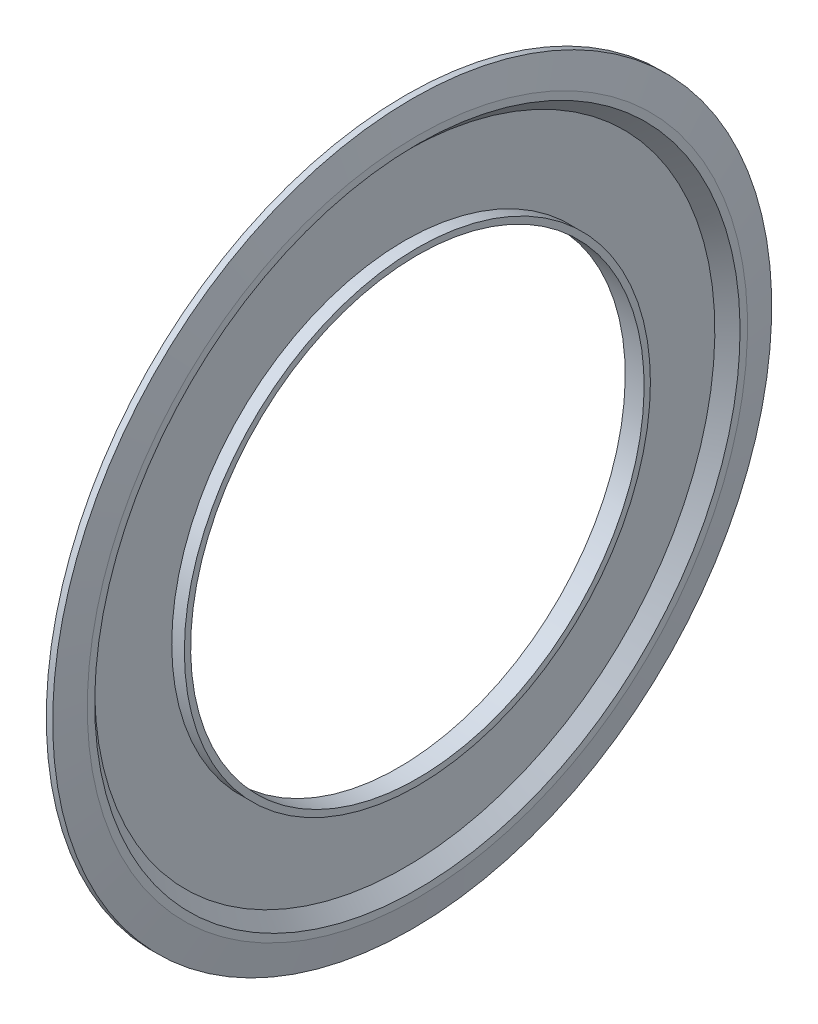
ISO-10303-21;
HEADER;
FILE_DESCRIPTION(('STEP AP214'),'2;1');
FILE_NAME('part.step','',(''),(''),'','','');
FILE_SCHEMA(('AUTOMOTIVE_DESIGN { 1 0 10303 214 1 1 1 1 }'));
ENDSEC;
DATA;
#1=APPLICATION_CONTEXT('core data for automotive mechanical design processes');
#2=APPLICATION_PROTOCOL_DEFINITION('international standard','automotive_design',2000,#1);
#3=PRODUCT_CONTEXT('',#1,'mechanical');
#4=PRODUCT('Part','Part','',(#3));
#5=PRODUCT_RELATED_PRODUCT_CATEGORY('part','',(#4));
#6=PRODUCT_DEFINITION_FORMATION('','',#4);
#7=PRODUCT_DEFINITION_CONTEXT('part definition',#1,'design');
#8=PRODUCT_DEFINITION('design','',#6,#7);
#9=PRODUCT_DEFINITION_SHAPE('','',#8);
#10=(LENGTH_UNIT() NAMED_UNIT(*) SI_UNIT(.MILLI.,.METRE.));
#11=(NAMED_UNIT(*) PLANE_ANGLE_UNIT() SI_UNIT($,.RADIAN.));
#12=(NAMED_UNIT(*) SI_UNIT($,.STERADIAN.) SOLID_ANGLE_UNIT());
#13=UNCERTAINTY_MEASURE_WITH_UNIT(LENGTH_MEASURE(1.E-05),#10,'distance_accuracy_value','');
#14=(GEOMETRIC_REPRESENTATION_CONTEXT(3) GLOBAL_UNCERTAINTY_ASSIGNED_CONTEXT((#13)) GLOBAL_UNIT_ASSIGNED_CONTEXT((#10,
#11,#12)) REPRESENTATION_CONTEXT('',''));
#15=CARTESIAN_POINT('',(0.,0.,0.));
#16=DIRECTION('',(0.,0.,1.));
#17=DIRECTION('',(1.,0.,0.));
#18=AXIS2_PLACEMENT_3D('',#15,#16,#17);
#19=CARTESIAN_POINT('',(0.410776862183425,5.438,0.));
#20=DIRECTION('',(1.,0.,0.));
#21=DIRECTION('',(0.,-1.,0.));
#22=AXIS2_PLACEMENT_3D('',#19,#20,#21);
#23=PLANE('',#22);
#24=CARTESIAN_POINT('',(0.410776862183425,0.,0.));
#25=DIRECTION('',(-1.,0.,0.));
#26=DIRECTION('',(0.,1.,0.));
#27=AXIS2_PLACEMENT_3D('',#24,#25,#26);
#28=CIRCLE('',#27,5.376);
#29=CARTESIAN_POINT('',(0.410776862183425,5.376,0.));
#30=VERTEX_POINT('',#29);
#31=EDGE_CURVE('E11',#30,#30,#28,.T.);
#32=ORIENTED_EDGE('',*,*,#31,.T.);
#33=EDGE_LOOP('',(#32));
#34=FACE_BOUND('',#33,.T.);
#35=CARTESIAN_POINT('',(0.410776862183425,0.,0.));
#36=DIRECTION('',(-1.,0.,0.));
#37=DIRECTION('',(0.,1.,0.));
#38=AXIS2_PLACEMENT_3D('',#35,#36,#37);
#39=CIRCLE('',#38,5.5);
#40=CARTESIAN_POINT('',(0.410776862183425,5.5,0.));
#41=VERTEX_POINT('',#40);
#42=EDGE_CURVE('E74',#41,#41,#39,.T.);
#43=ORIENTED_EDGE('',*,*,#42,.F.);
#44=EDGE_LOOP('',(#43));
#45=FACE_BOUND('',#44,.T.);
#46=ADVANCED_FACE('F16',(#34,#45),#23,.T.);
#47=CARTESIAN_POINT('',(0.305776862183426,0.,0.));
#48=DIRECTION('',(1.,0.,0.));
#49=DIRECTION('',(0.,1.,0.));
#50=AXIS2_PLACEMENT_3D('',#47,#48,#49);
#51=CONICAL_SURFACE('',#50,5.271,0.785398163397448);
#52=CARTESIAN_POINT('',(0.200776862183426,0.,0.));
#53=DIRECTION('',(-1.,0.,0.));
#54=DIRECTION('',(0.,1.,0.));
#55=AXIS2_PLACEMENT_3D('',#52,#53,#54);
#56=CIRCLE('',#55,5.166);
#57=CARTESIAN_POINT('',(0.200776862183426,5.166,0.));
#58=VERTEX_POINT('',#57);
#59=EDGE_CURVE('E26',#58,#58,#56,.T.);
#60=ORIENTED_EDGE('',*,*,#59,.T.);
#61=EDGE_LOOP('',(#60));
#62=FACE_BOUND('',#61,.T.);
#63=ORIENTED_EDGE('',*,*,#31,.F.);
#64=EDGE_LOOP('',(#63));
#65=FACE_BOUND('',#64,.T.);
#66=ADVANCED_FACE('F112',(#62,#65),#51,.F.);
#67=CARTESIAN_POINT('',(0.200776862183426,4.52425,0.));
#68=DIRECTION('',(1.,0.,0.));
#69=DIRECTION('',(0.,-1.,0.));
#70=AXIS2_PLACEMENT_3D('',#67,#68,#69);
#71=PLANE('',#70);
#72=CARTESIAN_POINT('',(0.200776862183426,0.,0.));
#73=DIRECTION('',(-1.,0.,0.));
#74=DIRECTION('',(0.,1.,0.));
#75=AXIS2_PLACEMENT_3D('',#72,#73,#74);
#76=CIRCLE('',#75,3.8825);
#77=CARTESIAN_POINT('',(0.200776862183426,3.8825,0.));
#78=VERTEX_POINT('',#77);
#79=EDGE_CURVE('E20',#78,#78,#76,.T.);
#80=ORIENTED_EDGE('',*,*,#79,.T.);
#81=EDGE_LOOP('',(#80));
#82=FACE_BOUND('',#81,.T.);
#83=ORIENTED_EDGE('',*,*,#59,.F.);
#84=EDGE_LOOP('',(#83));
#85=FACE_BOUND('',#84,.T.);
#86=ADVANCED_FACE('F98',(#82,#85),#71,.T.);
#87=CARTESIAN_POINT('',(0.305776862183426,0.,0.));
#88=DIRECTION('',(1.,0.,0.));
#89=DIRECTION('',(0.,1.,0.));
#90=AXIS2_PLACEMENT_3D('',#87,#88,#89);
#91=CYLINDRICAL_SURFACE('',#90,3.8825);
#92=CARTESIAN_POINT('',(0.410776862183425,0.,0.));
#93=DIRECTION('',(-1.,0.,0.));
#94=DIRECTION('',(0.,1.,0.));
#95=AXIS2_PLACEMENT_3D('',#92,#93,#94);
#96=CIRCLE('',#95,3.8825);
#97=CARTESIAN_POINT('',(0.410776862183425,3.8825,0.));
#98=VERTEX_POINT('',#97);
#99=EDGE_CURVE('E91',#98,#98,#96,.T.);
#100=ORIENTED_EDGE('',*,*,#99,.T.);
#101=EDGE_LOOP('',(#100));
#102=FACE_BOUND('',#101,.T.);
#103=ORIENTED_EDGE('',*,*,#79,.F.);
#104=EDGE_LOOP('',(#103));
#105=FACE_BOUND('',#104,.T.);
#106=ADVANCED_FACE('F101',(#102,#105),#91,.T.);
#107=CARTESIAN_POINT('',(0.410776862183425,3.83,0.));
#108=DIRECTION('',(1.,0.,0.));
#109=DIRECTION('',(0.,-1.,0.));
#110=AXIS2_PLACEMENT_3D('',#107,#108,#109);
#111=PLANE('',#110);
#112=CARTESIAN_POINT('',(0.410776862183425,0.,0.));
#113=DIRECTION('',(-1.,0.,0.));
#114=DIRECTION('',(0.,1.,0.));
#115=AXIS2_PLACEMENT_3D('',#112,#113,#114);
#116=CIRCLE('',#115,3.7775);
#117=CARTESIAN_POINT('',(0.410776862183425,3.7775,0.));
#118=VERTEX_POINT('',#117);
#119=EDGE_CURVE('E55',#118,#118,#116,.T.);
#120=ORIENTED_EDGE('',*,*,#119,.T.);
#121=EDGE_LOOP('',(#120));
#122=FACE_BOUND('',#121,.T.);
#123=ORIENTED_EDGE('',*,*,#99,.F.);
#124=EDGE_LOOP('',(#123));
#125=FACE_BOUND('',#124,.T.);
#126=ADVANCED_FACE('F103',(#122,#125),#111,.T.);
#127=CARTESIAN_POINT('',(0.253276862183425,0.,0.));
#128=DIRECTION('',(1.,0.,0.));
#129=DIRECTION('',(0.,1.,0.));
#130=AXIS2_PLACEMENT_3D('',#127,#128,#129);
#131=CYLINDRICAL_SURFACE('',#130,3.7775);
#132=CARTESIAN_POINT('',(0.0957768621834258,0.,0.));
#133=DIRECTION('',(-1.,0.,0.));
#134=DIRECTION('',(0.,1.,0.));
#135=AXIS2_PLACEMENT_3D('',#132,#133,#134);
#136=CIRCLE('',#135,3.7775);
#137=CARTESIAN_POINT('',(0.0957768621834258,3.7775,0.));
#138=VERTEX_POINT('',#137);
#139=EDGE_CURVE('E49',#138,#138,#136,.T.);
#140=ORIENTED_EDGE('',*,*,#139,.T.);
#141=EDGE_LOOP('',(#140));
#142=FACE_BOUND('',#141,.T.);
#143=ORIENTED_EDGE('',*,*,#119,.F.);
#144=EDGE_LOOP('',(#143));
#145=FACE_BOUND('',#144,.T.);
#146=ADVANCED_FACE('F110',(#142,#145),#131,.F.);
#147=CARTESIAN_POINT('',(0.0957768621834258,4.49349621202459,0.));
#148=DIRECTION('',(-1.,0.,0.));
#149=DIRECTION('',(0.,1.,0.));
#150=AXIS2_PLACEMENT_3D('',#147,#148,#149);
#151=PLANE('',#150);
#152=CARTESIAN_POINT('',(0.0957768621834258,0.,0.));
#153=DIRECTION('',(-1.,0.,0.));
#154=DIRECTION('',(0.,1.,0.));
#155=AXIS2_PLACEMENT_3D('',#152,#153,#154);
#156=CIRCLE('',#155,5.20949242404918);
#157=CARTESIAN_POINT('',(0.0957768621834258,5.20949242404918,0.));
#158=VERTEX_POINT('',#157);
#159=EDGE_CURVE('E84',#158,#158,#156,.T.);
#160=ORIENTED_EDGE('',*,*,#159,.T.);
#161=EDGE_LOOP('',(#160));
#162=FACE_BOUND('',#161,.T.);
#163=ORIENTED_EDGE('',*,*,#139,.F.);
#164=EDGE_LOOP('',(#163));
#165=FACE_BOUND('',#164,.T.);
#166=ADVANCED_FACE('F130',(#162,#165),#151,.T.);
#167=CARTESIAN_POINT('',(0.200776862183426,0.,0.));
#168=DIRECTION('',(1.,0.,0.));
#169=DIRECTION('',(0.,1.,0.));
#170=AXIS2_PLACEMENT_3D('',#167,#168,#169);
#171=CONICAL_SURFACE('',#170,5.31449242404918,0.785398163397445);
#172=CARTESIAN_POINT('',(0.305776862183426,0.,0.));
#173=DIRECTION('',(-1.,0.,0.));
#174=DIRECTION('',(0.,1.,0.));
#175=AXIS2_PLACEMENT_3D('',#172,#173,#174);
#176=CIRCLE('',#175,5.41949242404918);
#177=CARTESIAN_POINT('',(0.305776862183426,5.41949242404918,0.));
#178=VERTEX_POINT('',#177);
#179=EDGE_CURVE('E76',#178,#178,#176,.T.);
#180=ORIENTED_EDGE('',*,*,#179,.T.);
#181=EDGE_LOOP('',(#180));
#182=FACE_BOUND('',#181,.T.);
#183=ORIENTED_EDGE('',*,*,#159,.F.);
#184=EDGE_LOOP('',(#183));
#185=FACE_BOUND('',#184,.T.);
#186=ADVANCED_FACE('F127',(#182,#185),#171,.T.);
#187=CARTESIAN_POINT('',(0.305776862183426,5.45515305718948,0.));
#188=DIRECTION('',(-1.,0.,0.));
#189=DIRECTION('',(0.,1.,0.));
#190=AXIS2_PLACEMENT_3D('',#187,#188,#189);
#191=PLANE('',#190);
#192=CARTESIAN_POINT('',(0.305776862183426,0.,0.));
#193=DIRECTION('',(-1.,0.,0.));
#194=DIRECTION('',(0.,1.,0.));
#195=AXIS2_PLACEMENT_3D('',#192,#193,#194);
#196=CIRCLE('',#195,5.49081369032978);
#197=CARTESIAN_POINT('',(0.305776862183426,5.49081369032978,0.));
#198=VERTEX_POINT('',#197);
#199=EDGE_CURVE('E64',#198,#198,#196,.T.);
#200=ORIENTED_EDGE('',*,*,#199,.T.);
#201=EDGE_LOOP('',(#200));
#202=FACE_BOUND('',#201,.T.);
#203=ORIENTED_EDGE('',*,*,#179,.F.);
#204=EDGE_LOOP('',(#203));
#205=FACE_BOUND('',#204,.T.);
#206=ADVANCED_FACE('F126',(#202,#205),#191,.T.);
#207=CARTESIAN_POINT('',(0.26176685478585,0.,0.));
#208=DIRECTION('',(-1.,0.,0.));
#209=DIRECTION('',(0.,1.,0.));
#210=AXIS2_PLACEMENT_3D('',#207,#208,#209);
#211=CONICAL_SURFACE('',#210,5.74040684516489,1.39626340159546);
#212=CARTESIAN_POINT('',(0.217756847388274,0.,0.));
#213=DIRECTION('',(-1.,0.,0.));
#214=DIRECTION('',(0.,1.,0.));
#215=AXIS2_PLACEMENT_3D('',#212,#213,#214);
#216=CIRCLE('',#215,5.99);
#217=CARTESIAN_POINT('',(0.217756847388274,5.99,0.));
#218=VERTEX_POINT('',#217);
#219=EDGE_CURVE('E70',#218,#218,#216,.T.);
#220=ORIENTED_EDGE('',*,*,#219,.T.);
#221=EDGE_LOOP('',(#220));
#222=FACE_BOUND('',#221,.T.);
#223=ORIENTED_EDGE('',*,*,#199,.F.);
#224=EDGE_LOOP('',(#223));
#225=FACE_BOUND('',#224,.T.);
#226=ADVANCED_FACE('F71',(#222,#225),#211,.F.);
#227=CARTESIAN_POINT('',(0.271066744512276,0.,0.));
#228=DIRECTION('',(1.,0.,0.));
#229=DIRECTION('',(0.,1.,0.));
#230=AXIS2_PLACEMENT_3D('',#227,#228,#229);
#231=CYLINDRICAL_SURFACE('',#230,5.99);
#232=CARTESIAN_POINT('',(0.324376641636277,0.,0.));
#233=DIRECTION('',(-1.,0.,0.));
#234=DIRECTION('',(0.,1.,0.));
#235=AXIS2_PLACEMENT_3D('',#232,#233,#234);
#236=CIRCLE('',#235,5.99);
#237=CARTESIAN_POINT('',(0.324376641636277,5.99,0.));
#238=VERTEX_POINT('',#237);
#239=EDGE_CURVE('E78',#238,#238,#236,.T.);
#240=ORIENTED_EDGE('',*,*,#239,.T.);
#241=EDGE_LOOP('',(#240));
#242=FACE_BOUND('',#241,.T.);
#243=ORIENTED_EDGE('',*,*,#219,.F.);
#244=EDGE_LOOP('',(#243));
#245=FACE_BOUND('',#244,.T.);
#246=ADVANCED_FACE('F125',(#242,#245),#231,.T.);
#247=CARTESIAN_POINT('',(0.367576751909852,0.,0.));
#248=DIRECTION('',(-1.,0.,0.));
#249=DIRECTION('',(0.,1.,0.));
#250=AXIS2_PLACEMENT_3D('',#247,#248,#249);
#251=CONICAL_SURFACE('',#250,5.745,1.39626340159546);
#252=ORIENTED_EDGE('',*,*,#42,.T.);
#253=EDGE_LOOP('',(#252));
#254=FACE_BOUND('',#253,.T.);
#255=ORIENTED_EDGE('',*,*,#239,.F.);
#256=EDGE_LOOP('',(#255));
#257=FACE_BOUND('',#256,.T.);
#258=ADVANCED_FACE('F18',(#254,#257),#251,.T.);
#259=CLOSED_SHELL('',(#46,#66,#86,#106,#126,#146,#166,#186,#206,#226,#246,#258));
#260=MANIFOLD_SOLID_BREP('B1',#259);
#261=ADVANCED_BREP_SHAPE_REPRESENTATION('',(#18,#260),#14);
#262=SHAPE_DEFINITION_REPRESENTATION(#9,#261);
ENDSEC;
END-ISO-10303-21;
